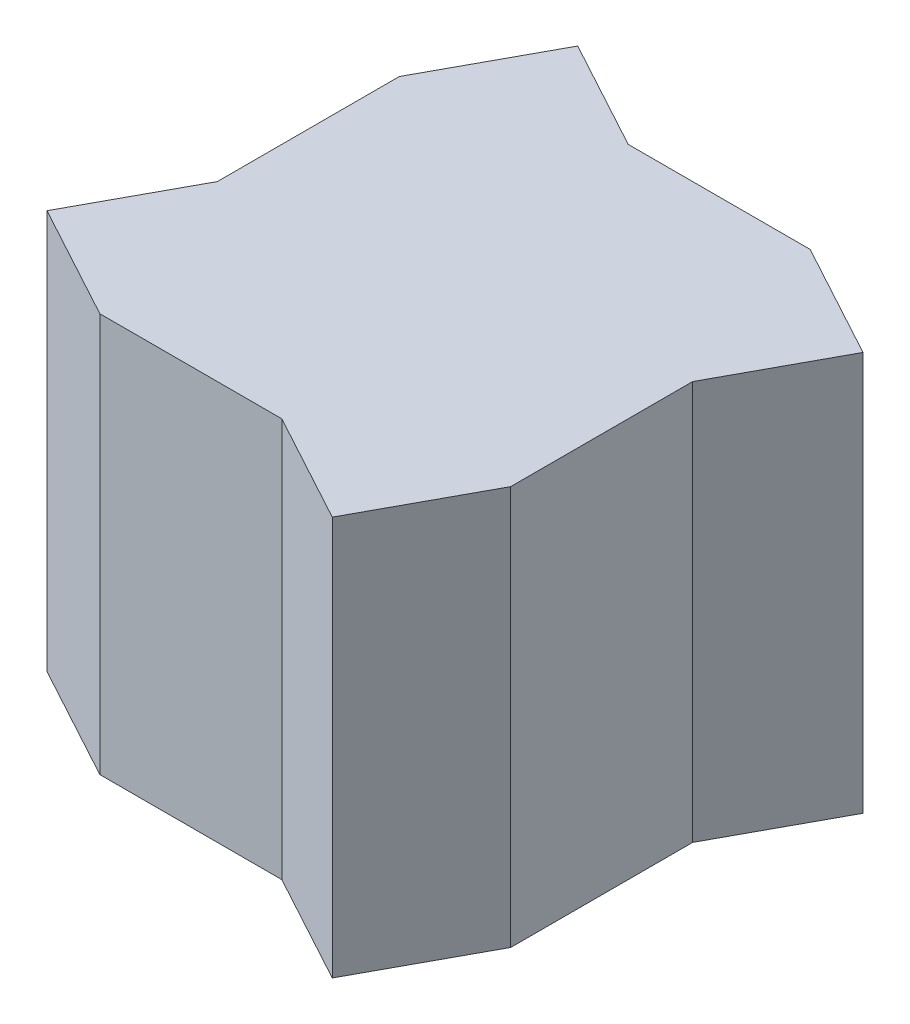
ISO-10303-21;
HEADER;
FILE_DESCRIPTION(('STEP AP214'),'2;1');
FILE_NAME('part.step','',(''),(''),'','','');
FILE_SCHEMA(('AUTOMOTIVE_DESIGN { 1 0 10303 214 1 1 1 1 }'));
ENDSEC;
DATA;
#1=APPLICATION_CONTEXT('core data for automotive mechanical design processes');
#2=APPLICATION_PROTOCOL_DEFINITION('international standard','automotive_design',2000,#1);
#3=PRODUCT_CONTEXT('',#1,'mechanical');
#4=PRODUCT('Part','Part','',(#3));
#5=PRODUCT_RELATED_PRODUCT_CATEGORY('part','',(#4));
#6=PRODUCT_DEFINITION_FORMATION('','',#4);
#7=PRODUCT_DEFINITION_CONTEXT('part definition',#1,'design');
#8=PRODUCT_DEFINITION('design','',#6,#7);
#9=PRODUCT_DEFINITION_SHAPE('','',#8);
#10=(LENGTH_UNIT() NAMED_UNIT(*) SI_UNIT(.MILLI.,.METRE.));
#11=(NAMED_UNIT(*) PLANE_ANGLE_UNIT() SI_UNIT($,.RADIAN.));
#12=(NAMED_UNIT(*) SI_UNIT($,.STERADIAN.) SOLID_ANGLE_UNIT());
#13=UNCERTAINTY_MEASURE_WITH_UNIT(LENGTH_MEASURE(1.E-05),#10,'distance_accuracy_value','');
#14=(GEOMETRIC_REPRESENTATION_CONTEXT(3) GLOBAL_UNCERTAINTY_ASSIGNED_CONTEXT((#13)) GLOBAL_UNIT_ASSIGNED_CONTEXT((#10,
#11,#12)) REPRESENTATION_CONTEXT('',''));
#15=CARTESIAN_POINT('',(0.,0.,0.));
#16=DIRECTION('',(0.,0.,1.));
#17=DIRECTION('',(1.,0.,0.));
#18=AXIS2_PLACEMENT_3D('',#15,#16,#17);
#19=CARTESIAN_POINT('',(-17.5,34.,-12.7539271317622));
#20=DIRECTION('',(1.,0.,0.));
#21=DIRECTION('',(0.,0.,-1.));
#22=AXIS2_PLACEMENT_3D('',#19,#20,#21);
#23=PLANE('',#22);
#24=DIRECTION('',(0.,0.,1.));
#25=VECTOR('',#24,1.);
#26=CARTESIAN_POINT('',(-17.5,0.,-12.7539271317622));
#27=LINE('',#26,#25);
#28=CARTESIAN_POINT('',(-17.5,0.,-12.7539271317622));
#29=VERTEX_POINT('',#28);
#30=CARTESIAN_POINT('',(-17.5,0.,2.74607286823769));
#31=VERTEX_POINT('',#30);
#32=EDGE_CURVE('E160',#29,#31,#27,.T.);
#33=ORIENTED_EDGE('',*,*,#32,.T.);
#34=DIRECTION('',(0.,-1.,0.));
#35=VECTOR('',#34,1.);
#36=CARTESIAN_POINT('',(-17.5,34.,2.74607286823769));
#37=LINE('',#36,#35);
#38=CARTESIAN_POINT('',(-17.5,34.,2.74607286823769));
#39=VERTEX_POINT('',#38);
#40=EDGE_CURVE('E11',#39,#31,#37,.T.);
#41=ORIENTED_EDGE('',*,*,#40,.F.);
#42=DIRECTION('',(0.,0.,1.));
#43=VECTOR('',#42,1.);
#44=CARTESIAN_POINT('',(-17.5,34.,-12.7539271317622));
#45=LINE('',#44,#43);
#46=CARTESIAN_POINT('',(-17.5,34.,-12.7539271317622));
#47=VERTEX_POINT('',#46);
#48=EDGE_CURVE('E184',#47,#39,#45,.T.);
#49=ORIENTED_EDGE('',*,*,#48,.F.);
#50=DIRECTION('',(0.,-1.,0.));
#51=VECTOR('',#50,1.);
#52=CARTESIAN_POINT('',(-17.5,34.,-12.7539271317622));
#53=LINE('',#52,#51);
#54=EDGE_CURVE('E156',#47,#29,#53,.T.);
#55=ORIENTED_EDGE('',*,*,#54,.T.);
#56=EDGE_LOOP('',(#33,#41,#49,#55));
#57=FACE_BOUND('',#56,.T.);
#58=ADVANCED_FACE('F39',(#57),#23,.F.);
#59=CARTESIAN_POINT('',(-17.5,34.,2.74607286823769));
#60=DIRECTION('',(0.878853431665693,0.,0.477091862904237));
#61=DIRECTION('',(0.477091862904237,0.,-0.878853431665693));
#62=AXIS2_PLACEMENT_3D('',#59,#60,#61);
#63=PLANE('',#62);
#64=DIRECTION('',(-0.477091862904237,0.,0.878853431665693));
#65=VECTOR('',#64,1.);
#66=CARTESIAN_POINT('',(-17.5,0.,2.74607286823769));
#67=LINE('',#66,#65);
#68=CARTESIAN_POINT('',(-22.60594529457,0.,12.1517615687613));
#69=VERTEX_POINT('',#68);
#70=EDGE_CURVE('E163',#31,#69,#67,.T.);
#71=ORIENTED_EDGE('',*,*,#70,.T.);
#72=DIRECTION('',(0.,-1.,0.));
#73=VECTOR('',#72,1.);
#74=CARTESIAN_POINT('',(-22.60594529457,34.,12.1517615687613));
#75=LINE('',#74,#73);
#76=CARTESIAN_POINT('',(-22.60594529457,34.,12.1517615687613));
#77=VERTEX_POINT('',#76);
#78=EDGE_CURVE('E47',#77,#69,#75,.T.);
#79=ORIENTED_EDGE('',*,*,#78,.F.);
#80=DIRECTION('',(-0.477091862904237,0.,0.878853431665693));
#81=VECTOR('',#80,1.);
#82=CARTESIAN_POINT('',(-17.5,34.,2.74607286823769));
#83=LINE('',#82,#81);
#84=EDGE_CURVE('E111',#39,#77,#83,.T.);
#85=ORIENTED_EDGE('',*,*,#84,.F.);
#86=ORIENTED_EDGE('',*,*,#40,.T.);
#87=EDGE_LOOP('',(#71,#79,#85,#86));
#88=FACE_BOUND('',#87,.T.);
#89=ADVANCED_FACE('F264',(#88),#63,.F.);
#90=CARTESIAN_POINT('',(-12.7539271317622,34.,17.4999999999999));
#91=DIRECTION('',(0.477091862904241,0.,-0.878853431665691));
#92=DIRECTION('',(-0.878853431665691,0.,-0.477091862904241));
#93=AXIS2_PLACEMENT_3D('',#90,#91,#92);
#94=PLANE('',#93);
#95=DIRECTION('',(0.878853431665691,0.,0.47709186290424));
#96=VECTOR('',#95,1.);
#97=CARTESIAN_POINT('',(-12.7539271317622,0.,17.4999999999999));
#98=LINE('',#97,#96);
#99=CARTESIAN_POINT('',(-12.7539271317622,0.,17.4999999999999));
#100=VERTEX_POINT('',#99);
#101=EDGE_CURVE('E165',#69,#100,#98,.T.);
#102=ORIENTED_EDGE('',*,*,#101,.T.);
#103=DIRECTION('',(0.,-1.,0.));
#104=VECTOR('',#103,1.);
#105=CARTESIAN_POINT('',(-12.7539271317622,34.,17.4999999999999));
#106=LINE('',#105,#104);
#107=CARTESIAN_POINT('',(-12.7539271317622,34.,17.4999999999999));
#108=VERTEX_POINT('',#107);
#109=EDGE_CURVE('E205',#108,#100,#106,.T.);
#110=ORIENTED_EDGE('',*,*,#109,.F.);
#111=DIRECTION('',(0.878853431665691,0.,0.47709186290424));
#112=VECTOR('',#111,1.);
#113=CARTESIAN_POINT('',(-12.7539271317622,34.,17.4999999999999));
#114=LINE('',#113,#112);
#115=EDGE_CURVE('E213',#77,#108,#114,.T.);
#116=ORIENTED_EDGE('',*,*,#115,.F.);
#117=ORIENTED_EDGE('',*,*,#78,.T.);
#118=EDGE_LOOP('',(#102,#110,#116,#117));
#119=FACE_BOUND('',#118,.T.);
#120=ADVANCED_FACE('F211',(#119),#94,.F.);
#121=CARTESIAN_POINT('',(-12.7539271317622,34.,17.4999999999999));
#122=DIRECTION('',(0.,0.,-1.));
#123=DIRECTION('',(-1.,0.,0.));
#124=AXIS2_PLACEMENT_3D('',#121,#122,#123);
#125=PLANE('',#124);
#126=DIRECTION('',(1.,0.,0.));
#127=VECTOR('',#126,1.);
#128=CARTESIAN_POINT('',(-12.7539271317622,0.,17.4999999999999));
#129=LINE('',#128,#127);
#130=CARTESIAN_POINT('',(2.74607286823761,0.,17.4999999999999));
#131=VERTEX_POINT('',#130);
#132=EDGE_CURVE('E167',#100,#131,#129,.T.);
#133=ORIENTED_EDGE('',*,*,#132,.T.);
#134=DIRECTION('',(0.,-1.,0.));
#135=VECTOR('',#134,1.);
#136=CARTESIAN_POINT('',(2.74607286823761,34.,17.4999999999999));
#137=LINE('',#136,#135);
#138=CARTESIAN_POINT('',(2.74607286823761,34.,17.4999999999999));
#139=VERTEX_POINT('',#138);
#140=EDGE_CURVE('E202',#139,#131,#137,.T.);
#141=ORIENTED_EDGE('',*,*,#140,.F.);
#142=DIRECTION('',(1.,0.,0.));
#143=VECTOR('',#142,1.);
#144=CARTESIAN_POINT('',(-12.7539271317622,34.,17.4999999999999));
#145=LINE('',#144,#143);
#146=EDGE_CURVE('E231',#108,#139,#145,.T.);
#147=ORIENTED_EDGE('',*,*,#146,.F.);
#148=ORIENTED_EDGE('',*,*,#109,.T.);
#149=EDGE_LOOP('',(#133,#141,#147,#148));
#150=FACE_BOUND('',#149,.T.);
#151=ADVANCED_FACE('F222',(#150),#125,.F.);
#152=CARTESIAN_POINT('',(2.74607286823761,34.,17.4999999999999));
#153=DIRECTION('',(0.477091862904233,0.,-0.878853431665695));
#154=DIRECTION('',(-0.878853431665695,0.,-0.477091862904233));
#155=AXIS2_PLACEMENT_3D('',#152,#153,#154);
#156=PLANE('',#155);
#157=DIRECTION('',(0.878853431665695,0.,0.477091862904233));
#158=VECTOR('',#157,1.);
#159=CARTESIAN_POINT('',(2.74607286823761,0.,17.4999999999999));
#160=LINE('',#159,#158);
#161=CARTESIAN_POINT('',(12.1517615687614,0.,22.60594529457));
#162=VERTEX_POINT('',#161);
#163=EDGE_CURVE('E169',#131,#162,#160,.T.);
#164=ORIENTED_EDGE('',*,*,#163,.T.);
#165=DIRECTION('',(0.,-1.,0.));
#166=VECTOR('',#165,1.);
#167=CARTESIAN_POINT('',(12.1517615687614,34.,22.60594529457));
#168=LINE('',#167,#166);
#169=CARTESIAN_POINT('',(12.1517615687614,34.,22.60594529457));
#170=VERTEX_POINT('',#169);
#171=EDGE_CURVE('E198',#170,#162,#168,.T.);
#172=ORIENTED_EDGE('',*,*,#171,.F.);
#173=DIRECTION('',(0.878853431665695,0.,0.477091862904233));
#174=VECTOR('',#173,1.);
#175=CARTESIAN_POINT('',(2.74607286823761,34.,17.4999999999999));
#176=LINE('',#175,#174);
#177=EDGE_CURVE('E228',#139,#170,#176,.T.);
#178=ORIENTED_EDGE('',*,*,#177,.F.);
#179=ORIENTED_EDGE('',*,*,#140,.T.);
#180=EDGE_LOOP('',(#164,#172,#178,#179));
#181=FACE_BOUND('',#180,.T.);
#182=ADVANCED_FACE('F226',(#181),#156,.F.);
#183=CARTESIAN_POINT('',(17.5,34.,12.7539271317622));
#184=DIRECTION('',(-0.878853431665693,0.,-0.477091862904236));
#185=DIRECTION('',(-0.477091862904236,0.,0.878853431665693));
#186=AXIS2_PLACEMENT_3D('',#183,#184,#185);
#187=PLANE('',#186);
#188=DIRECTION('',(0.477091862904236,0.,-0.878853431665693));
#189=VECTOR('',#188,1.);
#190=CARTESIAN_POINT('',(17.5,0.,12.7539271317622));
#191=LINE('',#190,#189);
#192=CARTESIAN_POINT('',(17.5,0.,12.7539271317622));
#193=VERTEX_POINT('',#192);
#194=EDGE_CURVE('E171',#162,#193,#191,.T.);
#195=ORIENTED_EDGE('',*,*,#194,.T.);
#196=DIRECTION('',(0.,-1.,0.));
#197=VECTOR('',#196,1.);
#198=CARTESIAN_POINT('',(17.5,34.,12.7539271317622));
#199=LINE('',#198,#197);
#200=CARTESIAN_POINT('',(17.5,34.,12.7539271317622));
#201=VERTEX_POINT('',#200);
#202=EDGE_CURVE('E195',#201,#193,#199,.T.);
#203=ORIENTED_EDGE('',*,*,#202,.F.);
#204=DIRECTION('',(0.477091862904236,0.,-0.878853431665693));
#205=VECTOR('',#204,1.);
#206=CARTESIAN_POINT('',(17.5,34.,12.7539271317622));
#207=LINE('',#206,#205);
#208=EDGE_CURVE('E230',#170,#201,#207,.T.);
#209=ORIENTED_EDGE('',*,*,#208,.F.);
#210=ORIENTED_EDGE('',*,*,#171,.T.);
#211=EDGE_LOOP('',(#195,#203,#209,#210));
#212=FACE_BOUND('',#211,.T.);
#213=ADVANCED_FACE('F277',(#212),#187,.F.);
#214=CARTESIAN_POINT('',(17.5,34.,12.7539271317622));
#215=DIRECTION('',(-1.,0.,0.));
#216=DIRECTION('',(0.,0.,1.));
#217=AXIS2_PLACEMENT_3D('',#214,#215,#216);
#218=PLANE('',#217);
#219=DIRECTION('',(0.,0.,-1.));
#220=VECTOR('',#219,1.);
#221=CARTESIAN_POINT('',(17.5,0.,12.7539271317622));
#222=LINE('',#221,#220);
#223=CARTESIAN_POINT('',(17.5,0.,-2.74607286823773));
#224=VERTEX_POINT('',#223);
#225=EDGE_CURVE('E173',#193,#224,#222,.T.);
#226=ORIENTED_EDGE('',*,*,#225,.T.);
#227=DIRECTION('',(0.,-1.,0.));
#228=VECTOR('',#227,1.);
#229=CARTESIAN_POINT('',(17.5,34.,-2.74607286823773));
#230=LINE('',#229,#228);
#231=CARTESIAN_POINT('',(17.5,34.,-2.74607286823773));
#232=VERTEX_POINT('',#231);
#233=EDGE_CURVE('E191',#232,#224,#230,.T.);
#234=ORIENTED_EDGE('',*,*,#233,.F.);
#235=DIRECTION('',(0.,0.,-1.));
#236=VECTOR('',#235,1.);
#237=CARTESIAN_POINT('',(17.5,34.,12.7539271317622));
#238=LINE('',#237,#236);
#239=EDGE_CURVE('E233',#201,#232,#238,.T.);
#240=ORIENTED_EDGE('',*,*,#239,.F.);
#241=ORIENTED_EDGE('',*,*,#202,.T.);
#242=EDGE_LOOP('',(#226,#234,#240,#241));
#243=FACE_BOUND('',#242,.T.);
#244=ADVANCED_FACE('F280',(#243),#218,.F.);
#245=CARTESIAN_POINT('',(17.5,34.,-2.74607286823773));
#246=DIRECTION('',(-0.878853431665697,0.,-0.477091862904229));
#247=DIRECTION('',(-0.477091862904229,0.,0.878853431665697));
#248=AXIS2_PLACEMENT_3D('',#245,#246,#247);
#249=PLANE('',#248);
#250=DIRECTION('',(0.477091862904229,0.,-0.878853431665697));
#251=VECTOR('',#250,1.);
#252=CARTESIAN_POINT('',(17.5,0.,-2.74607286823773));
#253=LINE('',#252,#251);
#254=CARTESIAN_POINT('',(22.6059452945699,0.,-12.1517615687615));
#255=VERTEX_POINT('',#254);
#256=EDGE_CURVE('E176',#224,#255,#253,.T.);
#257=ORIENTED_EDGE('',*,*,#256,.T.);
#258=DIRECTION('',(0.,-1.,0.));
#259=VECTOR('',#258,1.);
#260=CARTESIAN_POINT('',(22.6059452945699,34.,-12.1517615687615));
#261=LINE('',#260,#259);
#262=CARTESIAN_POINT('',(22.6059452945699,34.,-12.1517615687615));
#263=VERTEX_POINT('',#262);
#264=EDGE_CURVE('E188',#263,#255,#261,.T.);
#265=ORIENTED_EDGE('',*,*,#264,.F.);
#266=DIRECTION('',(0.477091862904229,0.,-0.878853431665697));
#267=VECTOR('',#266,1.);
#268=CARTESIAN_POINT('',(17.5,34.,-2.74607286823773));
#269=LINE('',#268,#267);
#270=EDGE_CURVE('E239',#232,#263,#269,.T.);
#271=ORIENTED_EDGE('',*,*,#270,.F.);
#272=ORIENTED_EDGE('',*,*,#233,.T.);
#273=EDGE_LOOP('',(#257,#265,#271,#272));
#274=FACE_BOUND('',#273,.T.);
#275=ADVANCED_FACE('F245',(#274),#249,.F.);
#276=CARTESIAN_POINT('',(12.7539271317621,34.,-17.5));
#277=DIRECTION('',(-0.477091862904233,0.,0.878853431665695));
#278=DIRECTION('',(0.878853431665695,0.,0.477091862904233));
#279=AXIS2_PLACEMENT_3D('',#276,#277,#278);
#280=PLANE('',#279);
#281=DIRECTION('',(-0.878853431665695,0.,-0.477091862904233));
#282=VECTOR('',#281,1.);
#283=CARTESIAN_POINT('',(12.7539271317621,0.,-17.5));
#284=LINE('',#283,#282);
#285=CARTESIAN_POINT('',(12.7539271317621,0.,-17.5));
#286=VERTEX_POINT('',#285);
#287=EDGE_CURVE('E179',#255,#286,#284,.T.);
#288=ORIENTED_EDGE('',*,*,#287,.T.);
#289=DIRECTION('',(0.,-1.,0.));
#290=VECTOR('',#289,1.);
#291=CARTESIAN_POINT('',(12.7539271317621,34.,-17.5));
#292=LINE('',#291,#290);
#293=CARTESIAN_POINT('',(12.7539271317621,34.,-17.5));
#294=VERTEX_POINT('',#293);
#295=EDGE_CURVE('E151',#294,#286,#292,.T.);
#296=ORIENTED_EDGE('',*,*,#295,.F.);
#297=DIRECTION('',(-0.878853431665695,0.,-0.477091862904233));
#298=VECTOR('',#297,1.);
#299=CARTESIAN_POINT('',(12.7539271317621,34.,-17.5));
#300=LINE('',#299,#298);
#301=EDGE_CURVE('E142',#263,#294,#300,.T.);
#302=ORIENTED_EDGE('',*,*,#301,.F.);
#303=ORIENTED_EDGE('',*,*,#264,.T.);
#304=EDGE_LOOP('',(#288,#296,#302,#303));
#305=FACE_BOUND('',#304,.T.);
#306=ADVANCED_FACE('F249',(#305),#280,.F.);
#307=CARTESIAN_POINT('',(12.7539271317621,34.,-17.5));
#308=DIRECTION('',(0.,0.,1.));
#309=DIRECTION('',(1.,0.,0.));
#310=AXIS2_PLACEMENT_3D('',#307,#308,#309);
#311=PLANE('',#310);
#312=DIRECTION('',(-1.,0.,0.));
#313=VECTOR('',#312,1.);
#314=CARTESIAN_POINT('',(12.7539271317621,0.,-17.5));
#315=LINE('',#314,#313);
#316=CARTESIAN_POINT('',(-2.7460728682379,0.,-17.5));
#317=VERTEX_POINT('',#316);
#318=EDGE_CURVE('E150',#286,#317,#315,.T.);
#319=ORIENTED_EDGE('',*,*,#318,.T.);
#320=DIRECTION('',(0.,-1.,0.));
#321=VECTOR('',#320,1.);
#322=CARTESIAN_POINT('',(-2.7460728682379,34.,-17.5));
#323=LINE('',#322,#321);
#324=CARTESIAN_POINT('',(-2.7460728682379,34.,-17.5));
#325=VERTEX_POINT('',#324);
#326=EDGE_CURVE('E147',#325,#317,#323,.T.);
#327=ORIENTED_EDGE('',*,*,#326,.F.);
#328=DIRECTION('',(-1.,0.,0.));
#329=VECTOR('',#328,1.);
#330=CARTESIAN_POINT('',(12.7539271317621,34.,-17.5));
#331=LINE('',#330,#329);
#332=EDGE_CURVE('E136',#294,#325,#331,.T.);
#333=ORIENTED_EDGE('',*,*,#332,.F.);
#334=ORIENTED_EDGE('',*,*,#295,.T.);
#335=EDGE_LOOP('',(#319,#327,#333,#334));
#336=FACE_BOUND('',#335,.T.);
#337=ADVANCED_FACE('F148',(#336),#311,.F.);
#338=CARTESIAN_POINT('',(-2.7460728682379,34.,-17.5));
#339=DIRECTION('',(-0.477091862904242,0.,0.87885343166569));
#340=DIRECTION('',(0.87885343166569,0.,0.477091862904242));
#341=AXIS2_PLACEMENT_3D('',#338,#339,#340);
#342=PLANE('',#341);
#343=DIRECTION('',(-0.87885343166569,0.,-0.477091862904242));
#344=VECTOR('',#343,1.);
#345=CARTESIAN_POINT('',(-2.7460728682379,0.,-17.5));
#346=LINE('',#345,#344);
#347=CARTESIAN_POINT('',(-12.1517615687614,0.,-22.60594529457));
#348=VERTEX_POINT('',#347);
#349=EDGE_CURVE('E97',#317,#348,#346,.T.);
#350=ORIENTED_EDGE('',*,*,#349,.T.);
#351=DIRECTION('',(0.,-1.,0.));
#352=VECTOR('',#351,1.);
#353=CARTESIAN_POINT('',(-12.1517615687614,34.,-22.60594529457));
#354=LINE('',#353,#352);
#355=CARTESIAN_POINT('',(-12.1517615687614,34.,-22.60594529457));
#356=VERTEX_POINT('',#355);
#357=EDGE_CURVE('E152',#356,#348,#354,.T.);
#358=ORIENTED_EDGE('',*,*,#357,.F.);
#359=DIRECTION('',(-0.87885343166569,0.,-0.477091862904242));
#360=VECTOR('',#359,1.);
#361=CARTESIAN_POINT('',(-2.7460728682379,34.,-17.5));
#362=LINE('',#361,#360);
#363=EDGE_CURVE('E140',#325,#356,#362,.T.);
#364=ORIENTED_EDGE('',*,*,#363,.F.);
#365=ORIENTED_EDGE('',*,*,#326,.T.);
#366=EDGE_LOOP('',(#350,#358,#364,#365));
#367=FACE_BOUND('',#366,.T.);
#368=ADVANCED_FACE('F154',(#367),#342,.F.);
#369=CARTESIAN_POINT('',(-17.5,34.,-12.7539271317622));
#370=DIRECTION('',(0.878853431665692,0.,0.477091862904239));
#371=DIRECTION('',(0.477091862904239,0.,-0.878853431665692));
#372=AXIS2_PLACEMENT_3D('',#369,#370,#371);
#373=PLANE('',#372);
#374=DIRECTION('',(-0.477091862904239,0.,0.878853431665692));
#375=VECTOR('',#374,1.);
#376=CARTESIAN_POINT('',(-17.5,0.,-12.7539271317622));
#377=LINE('',#376,#375);
#378=EDGE_CURVE('E103',#348,#29,#377,.T.);
#379=ORIENTED_EDGE('',*,*,#378,.T.);
#380=ORIENTED_EDGE('',*,*,#54,.F.);
#381=DIRECTION('',(-0.477091862904239,0.,0.878853431665692));
#382=VECTOR('',#381,1.);
#383=CARTESIAN_POINT('',(-17.5,34.,-12.7539271317622));
#384=LINE('',#383,#382);
#385=EDGE_CURVE('E55',#356,#47,#384,.T.);
#386=ORIENTED_EDGE('',*,*,#385,.F.);
#387=ORIENTED_EDGE('',*,*,#357,.T.);
#388=EDGE_LOOP('',(#379,#380,#386,#387));
#389=FACE_BOUND('',#388,.T.);
#390=ADVANCED_FACE('F253',(#389),#373,.F.);
#391=CARTESIAN_POINT('',(0.,34.,0.));
#392=DIRECTION('',(0.,1.,0.));
#393=DIRECTION('',(0.,0.,1.));
#394=AXIS2_PLACEMENT_3D('',#391,#392,#393);
#395=PLANE('',#394);
#396=ORIENTED_EDGE('',*,*,#48,.T.);
#397=ORIENTED_EDGE('',*,*,#84,.T.);
#398=ORIENTED_EDGE('',*,*,#115,.T.);
#399=ORIENTED_EDGE('',*,*,#146,.T.);
#400=ORIENTED_EDGE('',*,*,#177,.T.);
#401=ORIENTED_EDGE('',*,*,#208,.T.);
#402=ORIENTED_EDGE('',*,*,#239,.T.);
#403=ORIENTED_EDGE('',*,*,#270,.T.);
#404=ORIENTED_EDGE('',*,*,#301,.T.);
#405=ORIENTED_EDGE('',*,*,#332,.T.);
#406=ORIENTED_EDGE('',*,*,#363,.T.);
#407=ORIENTED_EDGE('',*,*,#385,.T.);
#408=EDGE_LOOP('',(#396,#397,#398,#399,#400,#401,#402,#403,#404,#405,#406,#407));
#409=FACE_BOUND('',#408,.T.);
#410=ADVANCED_FACE('F138',(#409),#395,.T.);
#411=CARTESIAN_POINT('',(0.,0.,0.));
#412=DIRECTION('',(0.,1.,0.));
#413=DIRECTION('',(0.,0.,1.));
#414=AXIS2_PLACEMENT_3D('',#411,#412,#413);
#415=PLANE('',#414);
#416=ORIENTED_EDGE('',*,*,#32,.F.);
#417=ORIENTED_EDGE('',*,*,#378,.F.);
#418=ORIENTED_EDGE('',*,*,#349,.F.);
#419=ORIENTED_EDGE('',*,*,#318,.F.);
#420=ORIENTED_EDGE('',*,*,#287,.F.);
#421=ORIENTED_EDGE('',*,*,#256,.F.);
#422=ORIENTED_EDGE('',*,*,#225,.F.);
#423=ORIENTED_EDGE('',*,*,#194,.F.);
#424=ORIENTED_EDGE('',*,*,#163,.F.);
#425=ORIENTED_EDGE('',*,*,#132,.F.);
#426=ORIENTED_EDGE('',*,*,#101,.F.);
#427=ORIENTED_EDGE('',*,*,#70,.F.);
#428=EDGE_LOOP('',(#416,#417,#418,#419,#420,#421,#422,#423,#424,#425,#426,#427));
#429=FACE_BOUND('',#428,.T.);
#430=ADVANCED_FACE('F217',(#429),#415,.F.);
#431=CLOSED_SHELL('',(#58,#89,#120,#151,#182,#213,#244,#275,#306,#337,#368,#390,#410,#430));
#432=MANIFOLD_SOLID_BREP('B2',#431);
#433=ADVANCED_BREP_SHAPE_REPRESENTATION('',(#18,#432),#14);
#434=SHAPE_DEFINITION_REPRESENTATION(#9,#433);
ENDSEC;
END-ISO-10303-21;
